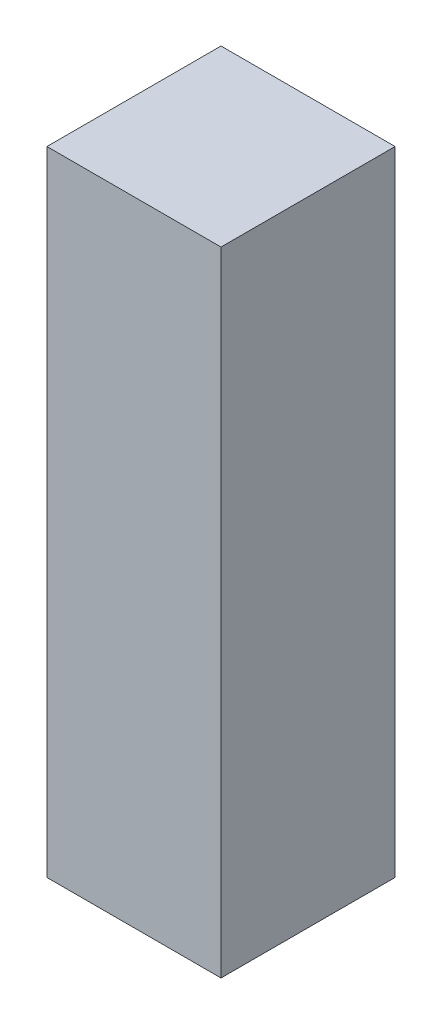
ISO-10303-21;
HEADER;
FILE_DESCRIPTION(('STEP AP214'),'2;1');
FILE_NAME('part.step','',(''),(''),'','','');
FILE_SCHEMA(('AUTOMOTIVE_DESIGN { 1 0 10303 214 1 1 1 1 }'));
ENDSEC;
DATA;
#1=APPLICATION_CONTEXT('core data for automotive mechanical design processes');
#2=APPLICATION_PROTOCOL_DEFINITION('international standard','automotive_design',2000,#1);
#3=PRODUCT_CONTEXT('',#1,'mechanical');
#4=PRODUCT('Part','Part','',(#3));
#5=PRODUCT_RELATED_PRODUCT_CATEGORY('part','',(#4));
#6=PRODUCT_DEFINITION_FORMATION('','',#4);
#7=PRODUCT_DEFINITION_CONTEXT('part definition',#1,'design');
#8=PRODUCT_DEFINITION('design','',#6,#7);
#9=PRODUCT_DEFINITION_SHAPE('','',#8);
#10=(LENGTH_UNIT() NAMED_UNIT(*) SI_UNIT(.MILLI.,.METRE.));
#11=(NAMED_UNIT(*) PLANE_ANGLE_UNIT() SI_UNIT($,.RADIAN.));
#12=(NAMED_UNIT(*) SI_UNIT($,.STERADIAN.) SOLID_ANGLE_UNIT());
#13=UNCERTAINTY_MEASURE_WITH_UNIT(LENGTH_MEASURE(1.E-05),#10,'distance_accuracy_value','');
#14=(GEOMETRIC_REPRESENTATION_CONTEXT(3) GLOBAL_UNCERTAINTY_ASSIGNED_CONTEXT((#13)) GLOBAL_UNIT_ASSIGNED_CONTEXT((#10,
#11,#12)) REPRESENTATION_CONTEXT('',''));
#15=CARTESIAN_POINT('',(0.,0.,0.));
#16=DIRECTION('',(0.,0.,1.));
#17=DIRECTION('',(1.,0.,0.));
#18=AXIS2_PLACEMENT_3D('',#15,#16,#17);
#19=CARTESIAN_POINT('',(35.,-0.0100000000000744,614.99));
#20=DIRECTION('',(-1.,0.,0.));
#21=DIRECTION('',(0.,0.,1.));
#22=AXIS2_PLACEMENT_3D('',#19,#20,#21);
#23=PLANE('',#22);
#24=DIRECTION('',(0.,0.,1.));
#25=VECTOR('',#24,1.);
#26=CARTESIAN_POINT('',(35.,79.9999999999999,626.));
#27=LINE('',#26,#25);
#28=CARTESIAN_POINT('',(35.,79.9999999999999,615.));
#29=VERTEX_POINT('',#28);
#30=CARTESIAN_POINT('',(35.,79.9999999999999,637.));
#31=VERTEX_POINT('',#30);
#32=EDGE_CURVE('E58',#29,#31,#27,.T.);
#33=ORIENTED_EDGE('',*,*,#32,.F.);
#34=DIRECTION('',(0.,1.,0.));
#35=VECTOR('',#34,1.);
#36=CARTESIAN_POINT('',(35.,39.9999999999999,615.));
#37=LINE('',#36,#35);
#38=CARTESIAN_POINT('',(35.,0.,615.));
#39=VERTEX_POINT('',#38);
#40=EDGE_CURVE('E21',#39,#29,#37,.T.);
#41=ORIENTED_EDGE('',*,*,#40,.F.);
#42=DIRECTION('',(0.,0.,-1.));
#43=VECTOR('',#42,1.);
#44=CARTESIAN_POINT('',(35.,0.,626.));
#45=LINE('',#44,#43);
#46=CARTESIAN_POINT('',(35.,0.,637.));
#47=VERTEX_POINT('',#46);
#48=EDGE_CURVE('E80',#47,#39,#45,.T.);
#49=ORIENTED_EDGE('',*,*,#48,.F.);
#50=DIRECTION('',(0.,-1.,0.));
#51=VECTOR('',#50,1.);
#52=CARTESIAN_POINT('',(35.,39.9999999999999,637.));
#53=LINE('',#52,#51);
#54=EDGE_CURVE('E56',#31,#47,#53,.T.);
#55=ORIENTED_EDGE('',*,*,#54,.F.);
#56=EDGE_LOOP('',(#33,#41,#49,#55));
#57=FACE_BOUND('',#56,.T.);
#58=ADVANCED_FACE('F17',(#57),#23,.T.);
#59=CARTESIAN_POINT('',(57.01,80.0099999999999,615.));
#60=DIRECTION('',(0.,0.,-1.));
#61=DIRECTION('',(0.,-1.,0.));
#62=AXIS2_PLACEMENT_3D('',#59,#60,#61);
#63=PLANE('',#62);
#64=DIRECTION('',(0.,1.,0.));
#65=VECTOR('',#64,1.);
#66=CARTESIAN_POINT('',(57.,39.9999999999999,615.));
#67=LINE('',#66,#65);
#68=CARTESIAN_POINT('',(57.,0.,615.));
#69=VERTEX_POINT('',#68);
#70=CARTESIAN_POINT('',(57.,79.9999999999999,615.));
#71=VERTEX_POINT('',#70);
#72=EDGE_CURVE('E84',#69,#71,#67,.T.);
#73=ORIENTED_EDGE('',*,*,#72,.F.);
#74=DIRECTION('',(1.,0.,0.));
#75=VECTOR('',#74,1.);
#76=CARTESIAN_POINT('',(46.,0.,615.));
#77=LINE('',#76,#75);
#78=EDGE_CURVE('E69',#39,#69,#77,.T.);
#79=ORIENTED_EDGE('',*,*,#78,.F.);
#80=ORIENTED_EDGE('',*,*,#40,.T.);
#81=DIRECTION('',(-1.,0.,0.));
#82=VECTOR('',#81,1.);
#83=CARTESIAN_POINT('',(46.,79.9999999999999,615.));
#84=LINE('',#83,#82);
#85=EDGE_CURVE('E64',#71,#29,#84,.T.);
#86=ORIENTED_EDGE('',*,*,#85,.F.);
#87=EDGE_LOOP('',(#73,#79,#80,#86));
#88=FACE_BOUND('',#87,.T.);
#89=ADVANCED_FACE('F66',(#88),#63,.T.);
#90=CARTESIAN_POINT('',(57.01,79.9999999999999,637.01));
#91=DIRECTION('',(0.,1.,0.));
#92=DIRECTION('',(0.,0.,-1.));
#93=AXIS2_PLACEMENT_3D('',#90,#91,#92);
#94=PLANE('',#93);
#95=DIRECTION('',(0.,0.,1.));
#96=VECTOR('',#95,1.);
#97=CARTESIAN_POINT('',(57.,79.9999999999999,626.));
#98=LINE('',#97,#96);
#99=CARTESIAN_POINT('',(57.,79.9999999999999,637.));
#100=VERTEX_POINT('',#99);
#101=EDGE_CURVE('E73',#71,#100,#98,.T.);
#102=ORIENTED_EDGE('',*,*,#101,.F.);
#103=ORIENTED_EDGE('',*,*,#85,.T.);
#104=ORIENTED_EDGE('',*,*,#32,.T.);
#105=DIRECTION('',(-1.,0.,0.));
#106=VECTOR('',#105,1.);
#107=CARTESIAN_POINT('',(46.,79.9999999999999,637.));
#108=LINE('',#107,#106);
#109=EDGE_CURVE('E76',#100,#31,#108,.T.);
#110=ORIENTED_EDGE('',*,*,#109,.F.);
#111=EDGE_LOOP('',(#102,#103,#104,#110));
#112=FACE_BOUND('',#111,.T.);
#113=ADVANCED_FACE('F71',(#112),#94,.T.);
#114=CARTESIAN_POINT('',(57.01,-0.0100000000000655,637.));
#115=DIRECTION('',(0.,0.,1.));
#116=DIRECTION('',(0.,1.,0.));
#117=AXIS2_PLACEMENT_3D('',#114,#115,#116);
#118=PLANE('',#117);
#119=DIRECTION('',(0.,-1.,0.));
#120=VECTOR('',#119,1.);
#121=CARTESIAN_POINT('',(57.,39.9999999999999,637.));
#122=LINE('',#121,#120);
#123=CARTESIAN_POINT('',(57.,0.,637.));
#124=VERTEX_POINT('',#123);
#125=EDGE_CURVE('E27',#100,#124,#122,.T.);
#126=ORIENTED_EDGE('',*,*,#125,.F.);
#127=ORIENTED_EDGE('',*,*,#109,.T.);
#128=ORIENTED_EDGE('',*,*,#54,.T.);
#129=DIRECTION('',(-1.,0.,0.));
#130=VECTOR('',#129,1.);
#131=CARTESIAN_POINT('',(46.,0.,637.));
#132=LINE('',#131,#130);
#133=EDGE_CURVE('E36',#124,#47,#132,.T.);
#134=ORIENTED_EDGE('',*,*,#133,.F.);
#135=EDGE_LOOP('',(#126,#127,#128,#134));
#136=FACE_BOUND('',#135,.T.);
#137=ADVANCED_FACE('F89',(#136),#118,.T.);
#138=CARTESIAN_POINT('',(57.01,0.,614.99));
#139=DIRECTION('',(0.,-1.,0.));
#140=DIRECTION('',(0.,0.,1.));
#141=AXIS2_PLACEMENT_3D('',#138,#139,#140);
#142=PLANE('',#141);
#143=DIRECTION('',(0.,0.,-1.));
#144=VECTOR('',#143,1.);
#145=CARTESIAN_POINT('',(57.,0.,626.));
#146=LINE('',#145,#144);
#147=EDGE_CURVE('E11',#124,#69,#146,.T.);
#148=ORIENTED_EDGE('',*,*,#147,.F.);
#149=ORIENTED_EDGE('',*,*,#133,.T.);
#150=ORIENTED_EDGE('',*,*,#48,.T.);
#151=ORIENTED_EDGE('',*,*,#78,.T.);
#152=EDGE_LOOP('',(#148,#149,#150,#151));
#153=FACE_BOUND('',#152,.T.);
#154=ADVANCED_FACE('F91',(#153),#142,.T.);
#155=CARTESIAN_POINT('',(57.,-0.0100000000000744,637.01));
#156=DIRECTION('',(1.,0.,0.));
#157=DIRECTION('',(0.,0.,-1.));
#158=AXIS2_PLACEMENT_3D('',#155,#156,#157);
#159=PLANE('',#158);
#160=ORIENTED_EDGE('',*,*,#125,.T.);
#161=ORIENTED_EDGE('',*,*,#147,.T.);
#162=ORIENTED_EDGE('',*,*,#72,.T.);
#163=ORIENTED_EDGE('',*,*,#101,.T.);
#164=EDGE_LOOP('',(#160,#161,#162,#163));
#165=FACE_BOUND('',#164,.T.);
#166=ADVANCED_FACE('F19',(#165),#159,.T.);
#167=CLOSED_SHELL('',(#58,#89,#113,#137,#154,#166));
#168=MANIFOLD_SOLID_BREP('B1',#167);
#169=ADVANCED_BREP_SHAPE_REPRESENTATION('',(#18,#168),#14);
#170=SHAPE_DEFINITION_REPRESENTATION(#9,#169);
ENDSEC;
END-ISO-10303-21;
